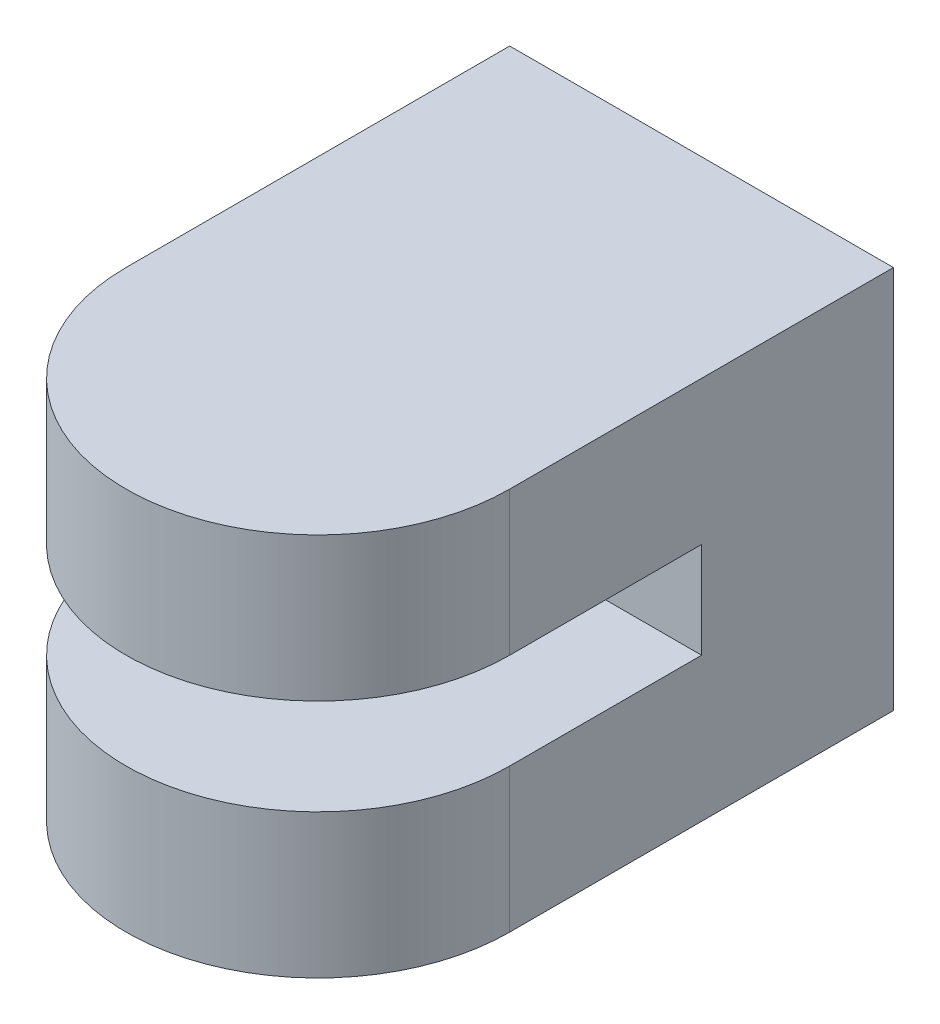
ISO-10303-21;
HEADER;
FILE_DESCRIPTION(('STEP AP214'),'2;1');
FILE_NAME('part.step','',(''),(''),'','','');
FILE_SCHEMA(('AUTOMOTIVE_DESIGN { 1 0 10303 214 1 1 1 1 }'));
ENDSEC;
DATA;
#1=APPLICATION_CONTEXT('core data for automotive mechanical design processes');
#2=APPLICATION_PROTOCOL_DEFINITION('international standard','automotive_design',2000,#1);
#3=PRODUCT_CONTEXT('',#1,'mechanical');
#4=PRODUCT('Part','Part','',(#3));
#5=PRODUCT_RELATED_PRODUCT_CATEGORY('part','',(#4));
#6=PRODUCT_DEFINITION_FORMATION('','',#4);
#7=PRODUCT_DEFINITION_CONTEXT('part definition',#1,'design');
#8=PRODUCT_DEFINITION('design','',#6,#7);
#9=PRODUCT_DEFINITION_SHAPE('','',#8);
#10=(LENGTH_UNIT() NAMED_UNIT(*) SI_UNIT(.MILLI.,.METRE.));
#11=(NAMED_UNIT(*) PLANE_ANGLE_UNIT() SI_UNIT($,.RADIAN.));
#12=(NAMED_UNIT(*) SI_UNIT($,.STERADIAN.) SOLID_ANGLE_UNIT());
#13=UNCERTAINTY_MEASURE_WITH_UNIT(LENGTH_MEASURE(1.E-05),#10,'distance_accuracy_value','');
#14=(GEOMETRIC_REPRESENTATION_CONTEXT(3) GLOBAL_UNCERTAINTY_ASSIGNED_CONTEXT((#13)) GLOBAL_UNIT_ASSIGNED_CONTEXT((#10,
#11,#12)) REPRESENTATION_CONTEXT('',''));
#15=CARTESIAN_POINT('',(0.,0.,0.));
#16=DIRECTION('',(0.,0.,1.));
#17=DIRECTION('',(1.,0.,0.));
#18=AXIS2_PLACEMENT_3D('',#15,#16,#17);
#19=CARTESIAN_POINT('',(0.,10.,0.));
#20=DIRECTION('',(0.,-1.,0.));
#21=DIRECTION('',(0.,0.,-1.));
#22=AXIS2_PLACEMENT_3D('',#19,#20,#21);
#23=CYLINDRICAL_SURFACE('',#22,10.);
#24=DIRECTION('',(0.,-1.,0.));
#25=VECTOR('',#24,1.);
#26=CARTESIAN_POINT('',(10.,10.,0.));
#27=LINE('',#26,#25);
#28=CARTESIAN_POINT('',(10.,-2.5,0.));
#29=VERTEX_POINT('',#28);
#30=CARTESIAN_POINT('',(10.,-10.,0.));
#31=VERTEX_POINT('',#30);
#32=EDGE_CURVE('E47',#29,#31,#27,.T.);
#33=ORIENTED_EDGE('',*,*,#32,.F.);
#34=CARTESIAN_POINT('',(0.,-2.5,0.));
#35=DIRECTION('',(0.,-1.,0.));
#36=DIRECTION('',(0.,0.,-1.));
#37=AXIS2_PLACEMENT_3D('',#34,#35,#36);
#38=CIRCLE('',#37,10.);
#39=CARTESIAN_POINT('',(-10.,-2.5,0.));
#40=VERTEX_POINT('',#39);
#41=EDGE_CURVE('E138',#29,#40,#38,.T.);
#42=ORIENTED_EDGE('',*,*,#41,.T.);
#43=DIRECTION('',(0.,-1.,0.));
#44=VECTOR('',#43,1.);
#45=CARTESIAN_POINT('',(-10.,10.,0.));
#46=LINE('',#45,#44);
#47=CARTESIAN_POINT('',(-10.,-10.,0.));
#48=VERTEX_POINT('',#47);
#49=EDGE_CURVE('E85',#40,#48,#46,.T.);
#50=ORIENTED_EDGE('',*,*,#49,.T.);
#51=CARTESIAN_POINT('',(0.,-10.,0.));
#52=DIRECTION('',(0.,1.,0.));
#53=DIRECTION('',(0.,0.,1.));
#54=AXIS2_PLACEMENT_3D('',#51,#52,#53);
#55=CIRCLE('',#54,10.);
#56=EDGE_CURVE('E141',#48,#31,#55,.T.);
#57=ORIENTED_EDGE('',*,*,#56,.T.);
#58=EDGE_LOOP('',(#33,#42,#50,#57));
#59=FACE_BOUND('',#58,.T.);
#60=ADVANCED_FACE('F39',(#59),#23,.T.);
#61=CARTESIAN_POINT('',(0.,2.5,0.));
#62=DIRECTION('',(0.,1.,0.));
#63=DIRECTION('',(0.,0.,1.));
#64=AXIS2_PLACEMENT_3D('',#61,#62,#63);
#65=CIRCLE('',#64,10.);
#66=CARTESIAN_POINT('',(-10.,2.5,0.));
#67=VERTEX_POINT('',#66);
#68=CARTESIAN_POINT('',(10.,2.5,0.));
#69=VERTEX_POINT('',#68);
#70=EDGE_CURVE('E136',#67,#69,#65,.T.);
#71=ORIENTED_EDGE('',*,*,#70,.T.);
#72=CARTESIAN_POINT('',(10.,10.,0.));
#73=VERTEX_POINT('',#72);
#74=EDGE_CURVE('E11',#73,#69,#27,.T.);
#75=ORIENTED_EDGE('',*,*,#74,.F.);
#76=CARTESIAN_POINT('',(0.,10.,0.));
#77=DIRECTION('',(0.,1.,0.));
#78=DIRECTION('',(0.,0.,1.));
#79=AXIS2_PLACEMENT_3D('',#76,#77,#78);
#80=CIRCLE('',#79,10.);
#81=CARTESIAN_POINT('',(-10.,10.,0.));
#82=VERTEX_POINT('',#81);
#83=EDGE_CURVE('E142',#82,#73,#80,.T.);
#84=ORIENTED_EDGE('',*,*,#83,.F.);
#85=EDGE_CURVE('E155',#82,#67,#46,.T.);
#86=ORIENTED_EDGE('',*,*,#85,.T.);
#87=EDGE_LOOP('',(#71,#75,#84,#86));
#88=FACE_BOUND('',#87,.T.);
#89=ADVANCED_FACE('F41',(#88),#23,.T.);
#90=CARTESIAN_POINT('',(10.,10.,0.));
#91=DIRECTION('',(-1.,0.,0.));
#92=DIRECTION('',(0.,0.,1.));
#93=AXIS2_PLACEMENT_3D('',#90,#91,#92);
#94=PLANE('',#93);
#95=DIRECTION('',(0.,1.,0.));
#96=VECTOR('',#95,1.);
#97=CARTESIAN_POINT('',(10.,-2.5,-10.));
#98=LINE('',#97,#96);
#99=CARTESIAN_POINT('',(10.,-2.5,-10.));
#100=VERTEX_POINT('',#99);
#101=CARTESIAN_POINT('',(10.,2.5,-10.));
#102=VERTEX_POINT('',#101);
#103=EDGE_CURVE('E119',#100,#102,#98,.T.);
#104=ORIENTED_EDGE('',*,*,#103,.F.);
#105=DIRECTION('',(0.,0.,1.));
#106=VECTOR('',#105,1.);
#107=CARTESIAN_POINT('',(10.,-2.5,-10.));
#108=LINE('',#107,#106);
#109=EDGE_CURVE('E139',#100,#29,#108,.T.);
#110=ORIENTED_EDGE('',*,*,#109,.T.);
#111=ORIENTED_EDGE('',*,*,#32,.T.);
#112=DIRECTION('',(0.,0.,-1.));
#113=VECTOR('',#112,1.);
#114=CARTESIAN_POINT('',(10.,-10.,0.));
#115=LINE('',#114,#113);
#116=CARTESIAN_POINT('',(10.,-10.,-20.));
#117=VERTEX_POINT('',#116);
#118=EDGE_CURVE('E150',#31,#117,#115,.T.);
#119=ORIENTED_EDGE('',*,*,#118,.T.);
#120=DIRECTION('',(0.,-1.,0.));
#121=VECTOR('',#120,1.);
#122=CARTESIAN_POINT('',(10.,10.,-20.));
#123=LINE('',#122,#121);
#124=CARTESIAN_POINT('',(10.,10.,-20.));
#125=VERTEX_POINT('',#124);
#126=EDGE_CURVE('E160',#125,#117,#123,.T.);
#127=ORIENTED_EDGE('',*,*,#126,.F.);
#128=DIRECTION('',(0.,0.,-1.));
#129=VECTOR('',#128,1.);
#130=CARTESIAN_POINT('',(10.,10.,0.));
#131=LINE('',#130,#129);
#132=EDGE_CURVE('E92',#73,#125,#131,.T.);
#133=ORIENTED_EDGE('',*,*,#132,.F.);
#134=ORIENTED_EDGE('',*,*,#74,.T.);
#135=DIRECTION('',(0.,0.,1.));
#136=VECTOR('',#135,1.);
#137=CARTESIAN_POINT('',(10.,2.5,-10.));
#138=LINE('',#137,#136);
#139=EDGE_CURVE('E114',#102,#69,#138,.T.);
#140=ORIENTED_EDGE('',*,*,#139,.F.);
#141=EDGE_LOOP('',(#104,#110,#111,#119,#127,#133,#134,#140));
#142=FACE_BOUND('',#141,.T.);
#143=ADVANCED_FACE('F128',(#142),#94,.F.);
#144=CARTESIAN_POINT('',(-10.,10.,-20.));
#145=DIRECTION('',(0.,0.,1.));
#146=DIRECTION('',(1.,0.,0.));
#147=AXIS2_PLACEMENT_3D('',#144,#145,#146);
#148=PLANE('',#147);
#149=DIRECTION('',(-1.,0.,0.));
#150=VECTOR('',#149,1.);
#151=CARTESIAN_POINT('',(-10.,-10.,-20.));
#152=LINE('',#151,#150);
#153=CARTESIAN_POINT('',(-10.,-10.,-20.));
#154=VERTEX_POINT('',#153);
#155=EDGE_CURVE('E152',#117,#154,#152,.T.);
#156=ORIENTED_EDGE('',*,*,#155,.T.);
#157=DIRECTION('',(0.,-1.,0.));
#158=VECTOR('',#157,1.);
#159=CARTESIAN_POINT('',(-10.,10.,-20.));
#160=LINE('',#159,#158);
#161=CARTESIAN_POINT('',(-10.,10.,-20.));
#162=VERTEX_POINT('',#161);
#163=EDGE_CURVE('E158',#162,#154,#160,.T.);
#164=ORIENTED_EDGE('',*,*,#163,.F.);
#165=DIRECTION('',(-1.,0.,0.));
#166=VECTOR('',#165,1.);
#167=CARTESIAN_POINT('',(-10.,10.,-20.));
#168=LINE('',#167,#166);
#169=EDGE_CURVE('E146',#125,#162,#168,.T.);
#170=ORIENTED_EDGE('',*,*,#169,.F.);
#171=ORIENTED_EDGE('',*,*,#126,.T.);
#172=EDGE_LOOP('',(#156,#164,#170,#171));
#173=FACE_BOUND('',#172,.T.);
#174=ADVANCED_FACE('F180',(#173),#148,.F.);
#175=CARTESIAN_POINT('',(-10.,10.,0.));
#176=DIRECTION('',(1.,0.,0.));
#177=DIRECTION('',(0.,0.,-1.));
#178=AXIS2_PLACEMENT_3D('',#175,#176,#177);
#179=PLANE('',#178);
#180=ORIENTED_EDGE('',*,*,#49,.F.);
#181=DIRECTION('',(0.,0.,1.));
#182=VECTOR('',#181,1.);
#183=CARTESIAN_POINT('',(-10.,-2.5,-10.));
#184=LINE('',#183,#182);
#185=CARTESIAN_POINT('',(-10.,-2.5,-10.));
#186=VERTEX_POINT('',#185);
#187=EDGE_CURVE('E131',#186,#40,#184,.T.);
#188=ORIENTED_EDGE('',*,*,#187,.F.);
#189=DIRECTION('',(0.,-1.,0.));
#190=VECTOR('',#189,1.);
#191=CARTESIAN_POINT('',(-10.,-2.5,-10.));
#192=LINE('',#191,#190);
#193=CARTESIAN_POINT('',(-10.,2.5,-10.));
#194=VERTEX_POINT('',#193);
#195=EDGE_CURVE('E118',#194,#186,#192,.T.);
#196=ORIENTED_EDGE('',*,*,#195,.F.);
#197=DIRECTION('',(0.,0.,1.));
#198=VECTOR('',#197,1.);
#199=CARTESIAN_POINT('',(-10.,2.5,-10.));
#200=LINE('',#199,#198);
#201=EDGE_CURVE('E116',#194,#67,#200,.T.);
#202=ORIENTED_EDGE('',*,*,#201,.T.);
#203=ORIENTED_EDGE('',*,*,#85,.F.);
#204=DIRECTION('',(0.,0.,1.));
#205=VECTOR('',#204,1.);
#206=CARTESIAN_POINT('',(-10.,10.,0.));
#207=LINE('',#206,#205);
#208=EDGE_CURVE('E63',#162,#82,#207,.T.);
#209=ORIENTED_EDGE('',*,*,#208,.F.);
#210=ORIENTED_EDGE('',*,*,#163,.T.);
#211=DIRECTION('',(0.,0.,1.));
#212=VECTOR('',#211,1.);
#213=CARTESIAN_POINT('',(-10.,-10.,0.));
#214=LINE('',#213,#212);
#215=EDGE_CURVE('E144',#154,#48,#214,.T.);
#216=ORIENTED_EDGE('',*,*,#215,.T.);
#217=EDGE_LOOP('',(#180,#188,#196,#202,#203,#209,#210,#216));
#218=FACE_BOUND('',#217,.T.);
#219=ADVANCED_FACE('F183',(#218),#179,.F.);
#220=CARTESIAN_POINT('',(0.,10.,0.));
#221=DIRECTION('',(0.,1.,0.));
#222=DIRECTION('',(0.,0.,1.));
#223=AXIS2_PLACEMENT_3D('',#220,#221,#222);
#224=PLANE('',#223);
#225=ORIENTED_EDGE('',*,*,#83,.T.);
#226=ORIENTED_EDGE('',*,*,#132,.T.);
#227=ORIENTED_EDGE('',*,*,#169,.T.);
#228=ORIENTED_EDGE('',*,*,#208,.T.);
#229=EDGE_LOOP('',(#225,#226,#227,#228));
#230=FACE_BOUND('',#229,.T.);
#231=ADVANCED_FACE('F191',(#230),#224,.T.);
#232=CARTESIAN_POINT('',(0.,-10.,0.));
#233=DIRECTION('',(0.,1.,0.));
#234=DIRECTION('',(0.,0.,1.));
#235=AXIS2_PLACEMENT_3D('',#232,#233,#234);
#236=PLANE('',#235);
#237=ORIENTED_EDGE('',*,*,#56,.F.);
#238=ORIENTED_EDGE('',*,*,#215,.F.);
#239=ORIENTED_EDGE('',*,*,#155,.F.);
#240=ORIENTED_EDGE('',*,*,#118,.F.);
#241=EDGE_LOOP('',(#237,#238,#239,#240));
#242=FACE_BOUND('',#241,.T.);
#243=ADVANCED_FACE('F169',(#242),#236,.F.);
#244=CARTESIAN_POINT('',(-10.,-2.5,-10.));
#245=DIRECTION('',(0.,-1.,0.));
#246=DIRECTION('',(0.,0.,-1.));
#247=AXIS2_PLACEMENT_3D('',#244,#245,#246);
#248=PLANE('',#247);
#249=ORIENTED_EDGE('',*,*,#109,.F.);
#250=DIRECTION('',(1.,0.,0.));
#251=VECTOR('',#250,1.);
#252=CARTESIAN_POINT('',(-10.,-2.5,-10.));
#253=LINE('',#252,#251);
#254=EDGE_CURVE('E125',#186,#100,#253,.T.);
#255=ORIENTED_EDGE('',*,*,#254,.F.);
#256=ORIENTED_EDGE('',*,*,#187,.T.);
#257=ORIENTED_EDGE('',*,*,#41,.F.);
#258=EDGE_LOOP('',(#249,#255,#256,#257));
#259=FACE_BOUND('',#258,.T.);
#260=ADVANCED_FACE('F189',(#259),#248,.F.);
#261=CARTESIAN_POINT('',(-10.,2.5,-10.));
#262=DIRECTION('',(0.,1.,0.));
#263=DIRECTION('',(0.,0.,1.));
#264=AXIS2_PLACEMENT_3D('',#261,#262,#263);
#265=PLANE('',#264);
#266=ORIENTED_EDGE('',*,*,#70,.F.);
#267=ORIENTED_EDGE('',*,*,#201,.F.);
#268=DIRECTION('',(-1.,0.,0.));
#269=VECTOR('',#268,1.);
#270=CARTESIAN_POINT('',(-10.,2.5,-10.));
#271=LINE('',#270,#269);
#272=EDGE_CURVE('E54',#102,#194,#271,.T.);
#273=ORIENTED_EDGE('',*,*,#272,.F.);
#274=ORIENTED_EDGE('',*,*,#139,.T.);
#275=EDGE_LOOP('',(#266,#267,#273,#274));
#276=FACE_BOUND('',#275,.T.);
#277=ADVANCED_FACE('F112',(#276),#265,.F.);
#278=CARTESIAN_POINT('',(0.,0.,-10.));
#279=DIRECTION('',(0.,0.,-1.));
#280=DIRECTION('',(-1.,0.,0.));
#281=AXIS2_PLACEMENT_3D('',#278,#279,#280);
#282=PLANE('',#281);
#283=ORIENTED_EDGE('',*,*,#103,.T.);
#284=ORIENTED_EDGE('',*,*,#272,.T.);
#285=ORIENTED_EDGE('',*,*,#195,.T.);
#286=ORIENTED_EDGE('',*,*,#254,.T.);
#287=EDGE_LOOP('',(#283,#284,#285,#286));
#288=FACE_BOUND('',#287,.T.);
#289=ADVANCED_FACE('F123',(#288),#282,.F.);
#290=CLOSED_SHELL('',(#60,#89,#143,#174,#219,#231,#243,#260,#277,#289));
#291=MANIFOLD_SOLID_BREP('B2',#290);
#292=ADVANCED_BREP_SHAPE_REPRESENTATION('',(#18,#291),#14);
#293=SHAPE_DEFINITION_REPRESENTATION(#9,#292);
ENDSEC;
END-ISO-10303-21;
